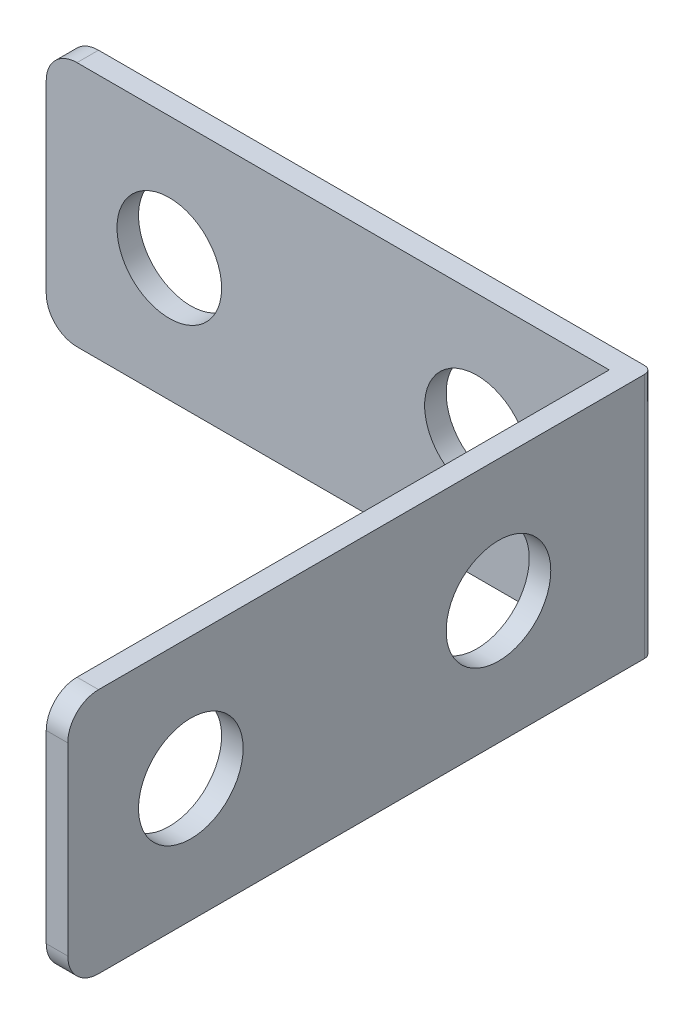
ISO-10303-21;
HEADER;
FILE_DESCRIPTION(('STEP AP214'),'2;1');
FILE_NAME('part.step','',(''),(''),'','','');
FILE_SCHEMA(('AUTOMOTIVE_DESIGN { 1 0 10303 214 1 1 1 1 }'));
ENDSEC;
DATA;
#1=APPLICATION_CONTEXT('core data for automotive mechanical design processes');
#2=APPLICATION_PROTOCOL_DEFINITION('international standard','automotive_design',2000,#1);
#3=PRODUCT_CONTEXT('',#1,'mechanical');
#4=PRODUCT('Part','Part','',(#3));
#5=PRODUCT_RELATED_PRODUCT_CATEGORY('part','',(#4));
#6=PRODUCT_DEFINITION_FORMATION('','',#4);
#7=PRODUCT_DEFINITION_CONTEXT('part definition',#1,'design');
#8=PRODUCT_DEFINITION('design','',#6,#7);
#9=PRODUCT_DEFINITION_SHAPE('','',#8);
#10=(LENGTH_UNIT() NAMED_UNIT(*) SI_UNIT(.MILLI.,.METRE.));
#11=(NAMED_UNIT(*) PLANE_ANGLE_UNIT() SI_UNIT($,.RADIAN.));
#12=(NAMED_UNIT(*) SI_UNIT($,.STERADIAN.) SOLID_ANGLE_UNIT());
#13=UNCERTAINTY_MEASURE_WITH_UNIT(LENGTH_MEASURE(1.E-05),#10,'distance_accuracy_value','');
#14=(GEOMETRIC_REPRESENTATION_CONTEXT(3) GLOBAL_UNCERTAINTY_ASSIGNED_CONTEXT((#13)) GLOBAL_UNIT_ASSIGNED_CONTEXT((#10,
#11,#12)) REPRESENTATION_CONTEXT('',''));
#15=CARTESIAN_POINT('',(0.,0.,0.));
#16=DIRECTION('',(0.,0.,1.));
#17=DIRECTION('',(1.,0.,0.));
#18=AXIS2_PLACEMENT_3D('',#15,#16,#17);
#19=CARTESIAN_POINT('',(0.,0.,0.7));
#20=DIRECTION('',(0.,0.,-1.));
#21=DIRECTION('',(-1.,0.,0.));
#22=AXIS2_PLACEMENT_3D('',#19,#20,#21);
#23=PLANE('',#22);
#24=CARTESIAN_POINT('',(4.5,0.,0.7));
#25=DIRECTION('',(0.,0.,1.));
#26=DIRECTION('',(1.,0.,0.));
#27=AXIS2_PLACEMENT_3D('',#24,#25,#26);
#28=CIRCLE('',#27,1.7);
#29=CARTESIAN_POINT('',(6.2,0.,0.7));
#30=VERTEX_POINT('',#29);
#31=EDGE_CURVE('E164',#30,#30,#28,.T.);
#32=ORIENTED_EDGE('',*,*,#31,.F.);
#33=EDGE_LOOP('',(#32));
#34=FACE_BOUND('',#33,.T.);
#35=CARTESIAN_POINT('',(-5.5,0.,0.7));
#36=DIRECTION('',(0.,0.,1.));
#37=DIRECTION('',(1.,0.,0.));
#38=AXIS2_PLACEMENT_3D('',#35,#36,#37);
#39=CIRCLE('',#38,1.7);
#40=CARTESIAN_POINT('',(-3.8,0.,0.7));
#41=VERTEX_POINT('',#40);
#42=EDGE_CURVE('E173',#41,#41,#39,.T.);
#43=ORIENTED_EDGE('',*,*,#42,.F.);
#44=EDGE_LOOP('',(#43));
#45=FACE_BOUND('',#44,.T.);
#46=DIRECTION('',(0.,-1.,0.));
#47=VECTOR('',#46,1.);
#48=CARTESIAN_POINT('',(-9.50000000000002,-4.00000000000001,0.7));
#49=LINE('',#48,#47);
#50=CARTESIAN_POINT('',(-9.50000000000002,3.,0.7));
#51=VERTEX_POINT('',#50);
#52=CARTESIAN_POINT('',(-9.50000000000002,-3.00000000000001,0.7));
#53=VERTEX_POINT('',#52);
#54=EDGE_CURVE('E141',#51,#53,#49,.T.);
#55=ORIENTED_EDGE('',*,*,#54,.T.);
#56=CARTESIAN_POINT('',(-8.50000000000001,-3.00000000000001,0.7));
#57=DIRECTION('',(0.,0.,-1.));
#58=DIRECTION('',(-1.,0.,0.));
#59=AXIS2_PLACEMENT_3D('',#56,#57,#58);
#60=CIRCLE('',#59,1.);
#61=CARTESIAN_POINT('',(-8.50000000000001,-4.00000000000001,0.7));
#62=VERTEX_POINT('',#61);
#63=EDGE_CURVE('E135',#53,#62,#60,.F.);
#64=ORIENTED_EDGE('',*,*,#63,.T.);
#65=DIRECTION('',(1.,0.,0.));
#66=VECTOR('',#65,1.);
#67=CARTESIAN_POINT('',(-9.50000000000002,-4.00000000000001,0.7));
#68=LINE('',#67,#66);
#69=CARTESIAN_POINT('',(8.8,-4.00000000000001,0.7));
#70=VERTEX_POINT('',#69);
#71=EDGE_CURVE('E127',#62,#70,#68,.T.);
#72=ORIENTED_EDGE('',*,*,#71,.T.);
#73=DIRECTION('',(0.,-1.,0.));
#74=VECTOR('',#73,1.);
#75=CARTESIAN_POINT('',(8.8,0.,0.7));
#76=LINE('',#75,#74);
#77=CARTESIAN_POINT('',(8.8,4.,0.7));
#78=VERTEX_POINT('',#77);
#79=EDGE_CURVE('E132',#78,#70,#76,.T.);
#80=ORIENTED_EDGE('',*,*,#79,.F.);
#81=DIRECTION('',(-1.,0.,0.));
#82=VECTOR('',#81,1.);
#83=CARTESIAN_POINT('',(-9.50000000000002,4.,0.7));
#84=LINE('',#83,#82);
#85=CARTESIAN_POINT('',(-8.50000000000001,4.,0.7));
#86=VERTEX_POINT('',#85);
#87=EDGE_CURVE('E181',#78,#86,#84,.T.);
#88=ORIENTED_EDGE('',*,*,#87,.T.);
#89=CARTESIAN_POINT('',(-8.50000000000001,3.,0.7));
#90=DIRECTION('',(0.,0.,-1.));
#91=DIRECTION('',(-1.,0.,0.));
#92=AXIS2_PLACEMENT_3D('',#89,#90,#91);
#93=CIRCLE('',#92,1.);
#94=EDGE_CURVE('E220',#86,#51,#93,.F.);
#95=ORIENTED_EDGE('',*,*,#94,.T.);
#96=EDGE_LOOP('',(#55,#64,#72,#80,#88,#95));
#97=FACE_BOUND('',#96,.T.);
#98=ADVANCED_FACE('F45',(#34,#45,#97),#23,.F.);
#99=CARTESIAN_POINT('',(0.,0.,0.));
#100=DIRECTION('',(0.,0.,-1.));
#101=DIRECTION('',(-1.,0.,0.));
#102=AXIS2_PLACEMENT_3D('',#99,#100,#101);
#103=PLANE('',#102);
#104=DIRECTION('',(-1.,0.,0.));
#105=VECTOR('',#104,1.);
#106=CARTESIAN_POINT('',(-9.50000000000002,4.,0.));
#107=LINE('',#106,#105);
#108=CARTESIAN_POINT('',(9.25,4.,0.));
#109=VERTEX_POINT('',#108);
#110=CARTESIAN_POINT('',(-8.50000000000001,4.,0.));
#111=VERTEX_POINT('',#110);
#112=EDGE_CURVE('E177',#109,#111,#107,.T.);
#113=ORIENTED_EDGE('',*,*,#112,.F.);
#114=DIRECTION('',(0.,1.,0.));
#115=VECTOR('',#114,1.);
#116=CARTESIAN_POINT('',(9.25,-4.00000000000001,0.));
#117=LINE('',#116,#115);
#118=CARTESIAN_POINT('',(9.25,-4.00000000000001,0.));
#119=VERTEX_POINT('',#118);
#120=EDGE_CURVE('E54',#109,#119,#117,.F.);
#121=ORIENTED_EDGE('',*,*,#120,.T.);
#122=DIRECTION('',(1.,0.,0.));
#123=VECTOR('',#122,1.);
#124=CARTESIAN_POINT('',(-9.50000000000002,-4.00000000000001,0.));
#125=LINE('',#124,#123);
#126=CARTESIAN_POINT('',(-8.50000000000001,-4.00000000000001,0.));
#127=VERTEX_POINT('',#126);
#128=EDGE_CURVE('E184',#127,#119,#125,.T.);
#129=ORIENTED_EDGE('',*,*,#128,.F.);
#130=CARTESIAN_POINT('',(-8.50000000000001,-3.00000000000001,0.));
#131=DIRECTION('',(0.,0.,-1.));
#132=DIRECTION('',(-1.,0.,0.));
#133=AXIS2_PLACEMENT_3D('',#130,#131,#132);
#134=CIRCLE('',#133,1.);
#135=CARTESIAN_POINT('',(-9.50000000000002,-3.00000000000001,0.));
#136=VERTEX_POINT('',#135);
#137=EDGE_CURVE('E210',#127,#136,#134,.T.);
#138=ORIENTED_EDGE('',*,*,#137,.T.);
#139=DIRECTION('',(0.,-1.,0.));
#140=VECTOR('',#139,1.);
#141=CARTESIAN_POINT('',(-9.50000000000002,-4.00000000000001,0.));
#142=LINE('',#141,#140);
#143=CARTESIAN_POINT('',(-9.50000000000002,3.,0.));
#144=VERTEX_POINT('',#143);
#145=EDGE_CURVE('E189',#144,#136,#142,.T.);
#146=ORIENTED_EDGE('',*,*,#145,.F.);
#147=CARTESIAN_POINT('',(-8.50000000000001,3.,0.));
#148=DIRECTION('',(0.,0.,-1.));
#149=DIRECTION('',(-1.,0.,0.));
#150=AXIS2_PLACEMENT_3D('',#147,#148,#149);
#151=CIRCLE('',#150,1.);
#152=EDGE_CURVE('E206',#144,#111,#151,.T.);
#153=ORIENTED_EDGE('',*,*,#152,.T.);
#154=EDGE_LOOP('',(#113,#121,#129,#138,#146,#153));
#155=FACE_BOUND('',#154,.T.);
#156=CARTESIAN_POINT('',(-5.5,0.,0.));
#157=DIRECTION('',(0.,0.,1.));
#158=DIRECTION('',(1.,0.,0.));
#159=AXIS2_PLACEMENT_3D('',#156,#157,#158);
#160=CIRCLE('',#159,1.7);
#161=CARTESIAN_POINT('',(-3.8,0.,0.));
#162=VERTEX_POINT('',#161);
#163=EDGE_CURVE('E171',#162,#162,#160,.T.);
#164=ORIENTED_EDGE('',*,*,#163,.T.);
#165=EDGE_LOOP('',(#164));
#166=FACE_BOUND('',#165,.T.);
#167=CARTESIAN_POINT('',(4.5,0.,0.));
#168=DIRECTION('',(0.,0.,1.));
#169=DIRECTION('',(1.,0.,0.));
#170=AXIS2_PLACEMENT_3D('',#167,#168,#169);
#171=CIRCLE('',#170,1.7);
#172=CARTESIAN_POINT('',(6.2,0.,0.));
#173=VERTEX_POINT('',#172);
#174=EDGE_CURVE('E160',#173,#173,#171,.T.);
#175=ORIENTED_EDGE('',*,*,#174,.T.);
#176=EDGE_LOOP('',(#175));
#177=FACE_BOUND('',#176,.T.);
#178=ADVANCED_FACE('F303',(#155,#166,#177),#103,.T.);
#179=CARTESIAN_POINT('',(9.5,-4.00000000000001,0.7));
#180=DIRECTION('',(-1.,0.,0.));
#181=DIRECTION('',(0.,0.,1.));
#182=AXIS2_PLACEMENT_3D('',#179,#180,#181);
#183=PLANE('',#182);
#184=DIRECTION('',(0.,0.,-1.));
#185=VECTOR('',#184,1.);
#186=CARTESIAN_POINT('',(9.5,-4.00000000000001,0.7));
#187=LINE('',#186,#185);
#188=CARTESIAN_POINT('',(9.5,-4.00000000000001,18.));
#189=VERTEX_POINT('',#188);
#190=CARTESIAN_POINT('',(9.5,-4.00000000000001,0.25));
#191=VERTEX_POINT('',#190);
#192=EDGE_CURVE('E140',#189,#191,#187,.T.);
#193=ORIENTED_EDGE('',*,*,#192,.T.);
#194=DIRECTION('',(0.,1.,0.));
#195=VECTOR('',#194,1.);
#196=CARTESIAN_POINT('',(9.5,4.,0.25));
#197=LINE('',#196,#195);
#198=CARTESIAN_POINT('',(9.5,4.,0.25));
#199=VERTEX_POINT('',#198);
#200=EDGE_CURVE('E251',#191,#199,#197,.T.);
#201=ORIENTED_EDGE('',*,*,#200,.T.);
#202=DIRECTION('',(0.,0.,-1.));
#203=VECTOR('',#202,1.);
#204=CARTESIAN_POINT('',(9.5,4.,0.7));
#205=LINE('',#204,#203);
#206=CARTESIAN_POINT('',(9.5,4.,18.));
#207=VERTEX_POINT('',#206);
#208=EDGE_CURVE('E198',#207,#199,#205,.T.);
#209=ORIENTED_EDGE('',*,*,#208,.F.);
#210=CARTESIAN_POINT('',(9.5,3.,18.));
#211=DIRECTION('',(-1.,0.,0.));
#212=DIRECTION('',(0.,0.,1.));
#213=AXIS2_PLACEMENT_3D('',#210,#211,#212);
#214=CIRCLE('',#213,1.);
#215=CARTESIAN_POINT('',(9.5,3.,19.));
#216=VERTEX_POINT('',#215);
#217=EDGE_CURVE('E235',#207,#216,#214,.F.);
#218=ORIENTED_EDGE('',*,*,#217,.T.);
#219=DIRECTION('',(0.,-1.,0.));
#220=VECTOR('',#219,1.);
#221=CARTESIAN_POINT('',(9.5,4.,19.));
#222=LINE('',#221,#220);
#223=CARTESIAN_POINT('',(9.5,-3.00000000000001,19.));
#224=VERTEX_POINT('',#223);
#225=EDGE_CURVE('E168',#216,#224,#222,.T.);
#226=ORIENTED_EDGE('',*,*,#225,.T.);
#227=CARTESIAN_POINT('',(9.5,-3.00000000000001,18.));
#228=DIRECTION('',(-1.,0.,0.));
#229=DIRECTION('',(0.,0.,1.));
#230=AXIS2_PLACEMENT_3D('',#227,#228,#229);
#231=CIRCLE('',#230,1.);
#232=EDGE_CURVE('E232',#224,#189,#231,.F.);
#233=ORIENTED_EDGE('',*,*,#232,.T.);
#234=EDGE_LOOP('',(#193,#201,#209,#218,#226,#233));
#235=FACE_BOUND('',#234,.T.);
#236=CARTESIAN_POINT('',(9.5,0.,5.));
#237=DIRECTION('',(1.,0.,0.));
#238=DIRECTION('',(0.,0.,-1.));
#239=AXIS2_PLACEMENT_3D('',#236,#237,#238);
#240=CIRCLE('',#239,1.7);
#241=CARTESIAN_POINT('',(9.5,0.,3.3));
#242=VERTEX_POINT('',#241);
#243=EDGE_CURVE('E282',#242,#242,#240,.T.);
#244=ORIENTED_EDGE('',*,*,#243,.F.);
#245=EDGE_LOOP('',(#244));
#246=FACE_BOUND('',#245,.T.);
#247=CARTESIAN_POINT('',(9.5,0.,15.));
#248=DIRECTION('',(1.,0.,0.));
#249=DIRECTION('',(0.,0.,-1.));
#250=AXIS2_PLACEMENT_3D('',#247,#248,#249);
#251=CIRCLE('',#250,1.7);
#252=CARTESIAN_POINT('',(9.5,0.,13.3));
#253=VERTEX_POINT('',#252);
#254=EDGE_CURVE('E291',#253,#253,#251,.T.);
#255=ORIENTED_EDGE('',*,*,#254,.F.);
#256=EDGE_LOOP('',(#255));
#257=FACE_BOUND('',#256,.T.);
#258=ADVANCED_FACE('F260',(#235,#246,#257),#183,.F.);
#259=CARTESIAN_POINT('',(-9.50000000000002,4.,0.7));
#260=DIRECTION('',(0.,-1.,0.));
#261=DIRECTION('',(0.,0.,-1.));
#262=AXIS2_PLACEMENT_3D('',#259,#260,#261);
#263=PLANE('',#262);
#264=ORIENTED_EDGE('',*,*,#208,.T.);
#265=CARTESIAN_POINT('',(9.25,4.,0.25));
#266=DIRECTION('',(0.,-1.,0.));
#267=DIRECTION('',(0.,0.,-1.));
#268=AXIS2_PLACEMENT_3D('',#265,#266,#267);
#269=CIRCLE('',#268,0.25);
#270=EDGE_CURVE('E68',#199,#109,#269,.F.);
#271=ORIENTED_EDGE('',*,*,#270,.T.);
#272=ORIENTED_EDGE('',*,*,#112,.T.);
#273=DIRECTION('',(0.,0.,-1.));
#274=VECTOR('',#273,1.);
#275=CARTESIAN_POINT('',(-8.50000000000001,4.,0.7));
#276=LINE('',#275,#274);
#277=EDGE_CURVE('E229',#111,#86,#276,.F.);
#278=ORIENTED_EDGE('',*,*,#277,.T.);
#279=ORIENTED_EDGE('',*,*,#87,.F.);
#280=DIRECTION('',(0.,0.,1.));
#281=VECTOR('',#280,1.);
#282=CARTESIAN_POINT('',(8.8,4.,0.));
#283=LINE('',#282,#281);
#284=CARTESIAN_POINT('',(8.8,4.,18.));
#285=VERTEX_POINT('',#284);
#286=EDGE_CURVE('E158',#78,#285,#283,.T.);
#287=ORIENTED_EDGE('',*,*,#286,.T.);
#288=DIRECTION('',(1.,0.,0.));
#289=VECTOR('',#288,1.);
#290=CARTESIAN_POINT('',(9.5,4.,18.));
#291=LINE('',#290,#289);
#292=EDGE_CURVE('E225',#285,#207,#291,.T.);
#293=ORIENTED_EDGE('',*,*,#292,.T.);
#294=EDGE_LOOP('',(#264,#271,#272,#278,#279,#287,#293));
#295=FACE_BOUND('',#294,.T.);
#296=ADVANCED_FACE('F264',(#295),#263,.F.);
#297=CARTESIAN_POINT('',(-9.50000000000002,-4.00000000000001,0.7));
#298=DIRECTION('',(1.,0.,0.));
#299=DIRECTION('',(0.,0.,-1.));
#300=AXIS2_PLACEMENT_3D('',#297,#298,#299);
#301=PLANE('',#300);
#302=ORIENTED_EDGE('',*,*,#145,.T.);
#303=DIRECTION('',(0.,0.,-1.));
#304=VECTOR('',#303,1.);
#305=CARTESIAN_POINT('',(-9.50000000000002,-3.00000000000001,0.7));
#306=LINE('',#305,#304);
#307=EDGE_CURVE('E217',#136,#53,#306,.F.);
#308=ORIENTED_EDGE('',*,*,#307,.T.);
#309=ORIENTED_EDGE('',*,*,#54,.F.);
#310=DIRECTION('',(0.,0.,-1.));
#311=VECTOR('',#310,1.);
#312=CARTESIAN_POINT('',(-9.50000000000002,3.,0.7));
#313=LINE('',#312,#311);
#314=EDGE_CURVE('E213',#51,#144,#313,.T.);
#315=ORIENTED_EDGE('',*,*,#314,.T.);
#316=EDGE_LOOP('',(#302,#308,#309,#315));
#317=FACE_BOUND('',#316,.T.);
#318=ADVANCED_FACE('F319',(#317),#301,.F.);
#319=CARTESIAN_POINT('',(-9.50000000000002,-4.00000000000001,0.7));
#320=DIRECTION('',(0.,1.,0.));
#321=DIRECTION('',(0.,0.,1.));
#322=AXIS2_PLACEMENT_3D('',#319,#320,#321);
#323=PLANE('',#322);
#324=ORIENTED_EDGE('',*,*,#128,.T.);
#325=CARTESIAN_POINT('',(9.25,-4.00000000000001,0.25));
#326=DIRECTION('',(0.,1.,0.));
#327=DIRECTION('',(0.,0.,1.));
#328=AXIS2_PLACEMENT_3D('',#325,#326,#327);
#329=CIRCLE('',#328,0.25);
#330=EDGE_CURVE('E11',#119,#191,#329,.F.);
#331=ORIENTED_EDGE('',*,*,#330,.T.);
#332=ORIENTED_EDGE('',*,*,#192,.F.);
#333=DIRECTION('',(1.,0.,0.));
#334=VECTOR('',#333,1.);
#335=CARTESIAN_POINT('',(8.8,-4.00000000000001,18.));
#336=LINE('',#335,#334);
#337=CARTESIAN_POINT('',(8.8,-4.00000000000001,18.));
#338=VERTEX_POINT('',#337);
#339=EDGE_CURVE('E148',#189,#338,#336,.F.);
#340=ORIENTED_EDGE('',*,*,#339,.T.);
#341=DIRECTION('',(0.,0.,-1.));
#342=VECTOR('',#341,1.);
#343=CARTESIAN_POINT('',(8.8,-4.00000000000001,0.));
#344=LINE('',#343,#342);
#345=EDGE_CURVE('E144',#338,#70,#344,.T.);
#346=ORIENTED_EDGE('',*,*,#345,.T.);
#347=ORIENTED_EDGE('',*,*,#71,.F.);
#348=DIRECTION('',(0.,0.,-1.));
#349=VECTOR('',#348,1.);
#350=CARTESIAN_POINT('',(-8.50000000000001,-4.00000000000001,0.7));
#351=LINE('',#350,#349);
#352=EDGE_CURVE('E203',#62,#127,#351,.T.);
#353=ORIENTED_EDGE('',*,*,#352,.T.);
#354=EDGE_LOOP('',(#324,#331,#332,#340,#346,#347,#353));
#355=FACE_BOUND('',#354,.T.);
#356=ADVANCED_FACE('F145',(#355),#323,.F.);
#357=CARTESIAN_POINT('',(-5.5,0.,0.7));
#358=DIRECTION('',(0.,0.,-1.));
#359=DIRECTION('',(-1.,0.,0.));
#360=AXIS2_PLACEMENT_3D('',#357,#358,#359);
#361=CYLINDRICAL_SURFACE('',#360,1.7);
#362=ORIENTED_EDGE('',*,*,#42,.T.);
#363=EDGE_LOOP('',(#362));
#364=FACE_BOUND('',#363,.T.);
#365=ORIENTED_EDGE('',*,*,#163,.F.);
#366=EDGE_LOOP('',(#365));
#367=FACE_BOUND('',#366,.T.);
#368=ADVANCED_FACE('F315',(#364,#367),#361,.F.);
#369=CARTESIAN_POINT('',(4.5,0.,0.7));
#370=DIRECTION('',(0.,0.,-1.));
#371=DIRECTION('',(-1.,0.,0.));
#372=AXIS2_PLACEMENT_3D('',#369,#370,#371);
#373=CYLINDRICAL_SURFACE('',#372,1.7);
#374=ORIENTED_EDGE('',*,*,#31,.T.);
#375=EDGE_LOOP('',(#374));
#376=FACE_BOUND('',#375,.T.);
#377=ORIENTED_EDGE('',*,*,#174,.F.);
#378=EDGE_LOOP('',(#377));
#379=FACE_BOUND('',#378,.T.);
#380=ADVANCED_FACE('F380',(#376,#379),#373,.F.);
#381=CARTESIAN_POINT('',(8.8,0.,0.));
#382=DIRECTION('',(1.,0.,0.));
#383=DIRECTION('',(0.,0.,-1.));
#384=AXIS2_PLACEMENT_3D('',#381,#382,#383);
#385=PLANE('',#384);
#386=CARTESIAN_POINT('',(8.8,0.,15.));
#387=DIRECTION('',(1.,0.,0.));
#388=DIRECTION('',(0.,0.,-1.));
#389=AXIS2_PLACEMENT_3D('',#386,#387,#388);
#390=CIRCLE('',#389,1.7);
#391=CARTESIAN_POINT('',(8.8,0.,13.3));
#392=VERTEX_POINT('',#391);
#393=EDGE_CURVE('E288',#392,#392,#390,.T.);
#394=ORIENTED_EDGE('',*,*,#393,.T.);
#395=EDGE_LOOP('',(#394));
#396=FACE_BOUND('',#395,.T.);
#397=CARTESIAN_POINT('',(8.8,0.,5.));
#398=DIRECTION('',(1.,0.,0.));
#399=DIRECTION('',(0.,0.,-1.));
#400=AXIS2_PLACEMENT_3D('',#397,#398,#399);
#401=CIRCLE('',#400,1.7);
#402=CARTESIAN_POINT('',(8.8,0.,3.3));
#403=VERTEX_POINT('',#402);
#404=EDGE_CURVE('E277',#403,#403,#401,.T.);
#405=ORIENTED_EDGE('',*,*,#404,.T.);
#406=EDGE_LOOP('',(#405));
#407=FACE_BOUND('',#406,.T.);
#408=DIRECTION('',(0.,-1.,0.));
#409=VECTOR('',#408,1.);
#410=CARTESIAN_POINT('',(8.8,4.,19.));
#411=LINE('',#410,#409);
#412=CARTESIAN_POINT('',(8.8,3.,19.));
#413=VERTEX_POINT('',#412);
#414=CARTESIAN_POINT('',(8.8,-3.00000000000001,19.));
#415=VERTEX_POINT('',#414);
#416=EDGE_CURVE('E152',#413,#415,#411,.T.);
#417=ORIENTED_EDGE('',*,*,#416,.F.);
#418=CARTESIAN_POINT('',(8.8,3.,18.));
#419=DIRECTION('',(1.,0.,0.));
#420=DIRECTION('',(0.,0.,-1.));
#421=AXIS2_PLACEMENT_3D('',#418,#419,#420);
#422=CIRCLE('',#421,1.);
#423=EDGE_CURVE('E248',#413,#285,#422,.F.);
#424=ORIENTED_EDGE('',*,*,#423,.T.);
#425=ORIENTED_EDGE('',*,*,#286,.F.);
#426=ORIENTED_EDGE('',*,*,#79,.T.);
#427=ORIENTED_EDGE('',*,*,#345,.F.);
#428=CARTESIAN_POINT('',(8.8,-3.00000000000001,18.));
#429=DIRECTION('',(1.,0.,0.));
#430=DIRECTION('',(0.,0.,-1.));
#431=AXIS2_PLACEMENT_3D('',#428,#429,#430);
#432=CIRCLE('',#431,1.);
#433=EDGE_CURVE('E245',#338,#415,#432,.F.);
#434=ORIENTED_EDGE('',*,*,#433,.T.);
#435=EDGE_LOOP('',(#417,#424,#425,#426,#427,#434));
#436=FACE_BOUND('',#435,.T.);
#437=ADVANCED_FACE('F156',(#396,#407,#436),#385,.F.);
#438=CARTESIAN_POINT('',(8.8,4.,19.));
#439=DIRECTION('',(0.,0.,1.));
#440=DIRECTION('',(1.,0.,0.));
#441=AXIS2_PLACEMENT_3D('',#438,#439,#440);
#442=PLANE('',#441);
#443=ORIENTED_EDGE('',*,*,#225,.F.);
#444=DIRECTION('',(1.,0.,0.));
#445=VECTOR('',#444,1.);
#446=CARTESIAN_POINT('',(8.8,3.,19.));
#447=LINE('',#446,#445);
#448=EDGE_CURVE('E242',#216,#413,#447,.F.);
#449=ORIENTED_EDGE('',*,*,#448,.T.);
#450=ORIENTED_EDGE('',*,*,#416,.T.);
#451=DIRECTION('',(1.,0.,0.));
#452=VECTOR('',#451,1.);
#453=CARTESIAN_POINT('',(9.5,-3.00000000000001,19.));
#454=LINE('',#453,#452);
#455=EDGE_CURVE('E238',#415,#224,#454,.T.);
#456=ORIENTED_EDGE('',*,*,#455,.T.);
#457=EDGE_LOOP('',(#443,#449,#450,#456));
#458=FACE_BOUND('',#457,.T.);
#459=ADVANCED_FACE('F273',(#458),#442,.T.);
#460=CARTESIAN_POINT('',(8.8,0.,5.));
#461=DIRECTION('',(1.,0.,0.));
#462=DIRECTION('',(0.,0.,-1.));
#463=AXIS2_PLACEMENT_3D('',#460,#461,#462);
#464=CYLINDRICAL_SURFACE('',#463,1.7);
#465=ORIENTED_EDGE('',*,*,#404,.F.);
#466=EDGE_LOOP('',(#465));
#467=FACE_BOUND('',#466,.T.);
#468=ORIENTED_EDGE('',*,*,#243,.T.);
#469=EDGE_LOOP('',(#468));
#470=FACE_BOUND('',#469,.T.);
#471=ADVANCED_FACE('F390',(#467,#470),#464,.F.);
#472=CARTESIAN_POINT('',(8.8,0.,15.));
#473=DIRECTION('',(1.,0.,0.));
#474=DIRECTION('',(0.,0.,-1.));
#475=AXIS2_PLACEMENT_3D('',#472,#473,#474);
#476=CYLINDRICAL_SURFACE('',#475,1.7);
#477=ORIENTED_EDGE('',*,*,#393,.F.);
#478=EDGE_LOOP('',(#477));
#479=FACE_BOUND('',#478,.T.);
#480=ORIENTED_EDGE('',*,*,#254,.T.);
#481=EDGE_LOOP('',(#480));
#482=FACE_BOUND('',#481,.T.);
#483=ADVANCED_FACE('F330',(#479,#482),#476,.F.);
#484=CARTESIAN_POINT('',(-8.50000000000001,-3.00000000000001,0.7));
#485=DIRECTION('',(0.,0.,-1.));
#486=DIRECTION('',(-1.,0.,0.));
#487=AXIS2_PLACEMENT_3D('',#484,#485,#486);
#488=CYLINDRICAL_SURFACE('',#487,1.);
#489=ORIENTED_EDGE('',*,*,#63,.F.);
#490=ORIENTED_EDGE('',*,*,#307,.F.);
#491=ORIENTED_EDGE('',*,*,#137,.F.);
#492=ORIENTED_EDGE('',*,*,#352,.F.);
#493=EDGE_LOOP('',(#489,#490,#491,#492));
#494=FACE_BOUND('',#493,.T.);
#495=ADVANCED_FACE('F326',(#494),#488,.T.);
#496=CARTESIAN_POINT('',(-8.50000000000001,3.,0.7));
#497=DIRECTION('',(0.,0.,-1.));
#498=DIRECTION('',(-1.,0.,0.));
#499=AXIS2_PLACEMENT_3D('',#496,#497,#498);
#500=CYLINDRICAL_SURFACE('',#499,1.);
#501=ORIENTED_EDGE('',*,*,#94,.F.);
#502=ORIENTED_EDGE('',*,*,#277,.F.);
#503=ORIENTED_EDGE('',*,*,#152,.F.);
#504=ORIENTED_EDGE('',*,*,#314,.F.);
#505=EDGE_LOOP('',(#501,#502,#503,#504));
#506=FACE_BOUND('',#505,.T.);
#507=ADVANCED_FACE('F329',(#506),#500,.T.);
#508=CARTESIAN_POINT('',(-9.50000000000002,3.,18.));
#509=DIRECTION('',(-1.,0.,0.));
#510=DIRECTION('',(0.,0.,1.));
#511=AXIS2_PLACEMENT_3D('',#508,#509,#510);
#512=CYLINDRICAL_SURFACE('',#511,1.);
#513=ORIENTED_EDGE('',*,*,#423,.F.);
#514=ORIENTED_EDGE('',*,*,#448,.F.);
#515=ORIENTED_EDGE('',*,*,#217,.F.);
#516=ORIENTED_EDGE('',*,*,#292,.F.);
#517=EDGE_LOOP('',(#513,#514,#515,#516));
#518=FACE_BOUND('',#517,.T.);
#519=ADVANCED_FACE('F268',(#518),#512,.T.);
#520=CARTESIAN_POINT('',(8.8,-3.00000000000001,18.));
#521=DIRECTION('',(-1.,0.,0.));
#522=DIRECTION('',(0.,0.,1.));
#523=AXIS2_PLACEMENT_3D('',#520,#521,#522);
#524=CYLINDRICAL_SURFACE('',#523,1.);
#525=ORIENTED_EDGE('',*,*,#433,.F.);
#526=ORIENTED_EDGE('',*,*,#339,.F.);
#527=ORIENTED_EDGE('',*,*,#232,.F.);
#528=ORIENTED_EDGE('',*,*,#455,.F.);
#529=EDGE_LOOP('',(#525,#526,#527,#528));
#530=FACE_BOUND('',#529,.T.);
#531=ADVANCED_FACE('F296',(#530),#524,.T.);
#532=CARTESIAN_POINT('',(9.25,-4.00000000000001,0.25));
#533=DIRECTION('',(0.,-1.,0.));
#534=DIRECTION('',(0.,0.,-1.));
#535=AXIS2_PLACEMENT_3D('',#532,#533,#534);
#536=CYLINDRICAL_SURFACE('',#535,0.25);
#537=ORIENTED_EDGE('',*,*,#330,.F.);
#538=ORIENTED_EDGE('',*,*,#120,.F.);
#539=ORIENTED_EDGE('',*,*,#270,.F.);
#540=ORIENTED_EDGE('',*,*,#200,.F.);
#541=EDGE_LOOP('',(#537,#538,#539,#540));
#542=FACE_BOUND('',#541,.T.);
#543=ADVANCED_FACE('F47',(#542),#536,.T.);
#544=CLOSED_SHELL('',(#98,#178,#258,#296,#318,#356,#368,#380,#437,#459,#471,#483,#495,#507,#519,
#531,#543));
#545=MANIFOLD_SOLID_BREP('B2',#544);
#546=ADVANCED_BREP_SHAPE_REPRESENTATION('',(#18,#545),#14);
#547=SHAPE_DEFINITION_REPRESENTATION(#9,#546);
ENDSEC;
END-ISO-10303-21;
